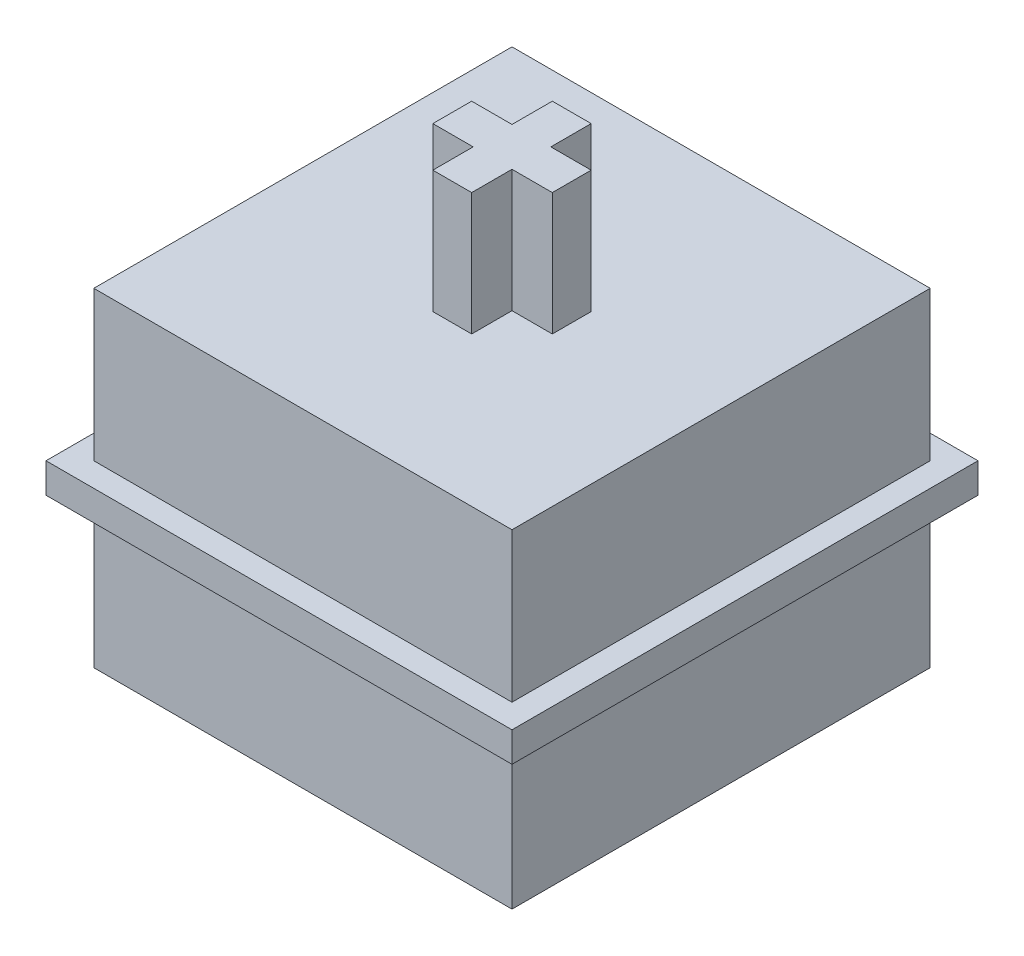
ISO-10303-21;
HEADER;
FILE_DESCRIPTION(('STEP AP214'),'2;1');
FILE_NAME('part.step','',(''),(''),'','','');
FILE_SCHEMA(('AUTOMOTIVE_DESIGN { 1 0 10303 214 1 1 1 1 }'));
ENDSEC;
DATA;
#1=APPLICATION_CONTEXT('core data for automotive mechanical design processes');
#2=APPLICATION_PROTOCOL_DEFINITION('international standard','automotive_design',2000,#1);
#3=PRODUCT_CONTEXT('',#1,'mechanical');
#4=PRODUCT('Part','Part','',(#3));
#5=PRODUCT_RELATED_PRODUCT_CATEGORY('part','',(#4));
#6=PRODUCT_DEFINITION_FORMATION('','',#4);
#7=PRODUCT_DEFINITION_CONTEXT('part definition',#1,'design');
#8=PRODUCT_DEFINITION('design','',#6,#7);
#9=PRODUCT_DEFINITION_SHAPE('','',#8);
#10=(LENGTH_UNIT() NAMED_UNIT(*) SI_UNIT(.MILLI.,.METRE.));
#11=(NAMED_UNIT(*) PLANE_ANGLE_UNIT() SI_UNIT($,.RADIAN.));
#12=(NAMED_UNIT(*) SI_UNIT($,.STERADIAN.) SOLID_ANGLE_UNIT());
#13=UNCERTAINTY_MEASURE_WITH_UNIT(LENGTH_MEASURE(1.E-05),#10,'distance_accuracy_value','');
#14=(GEOMETRIC_REPRESENTATION_CONTEXT(3) GLOBAL_UNCERTAINTY_ASSIGNED_CONTEXT((#13)) GLOBAL_UNIT_ASSIGNED_CONTEXT((#10,
#11,#12)) REPRESENTATION_CONTEXT('',''));
#15=CARTESIAN_POINT('',(0.,0.,0.));
#16=DIRECTION('',(0.,0.,1.));
#17=DIRECTION('',(1.,0.,0.));
#18=AXIS2_PLACEMENT_3D('',#15,#16,#17);
#19=CARTESIAN_POINT('',(0.,11.,0.));
#20=DIRECTION('',(0.,1.,0.));
#21=DIRECTION('',(0.,0.,1.));
#22=AXIS2_PLACEMENT_3D('',#19,#20,#21);
#23=PLANE('',#22);
#24=DIRECTION('',(0.,0.,1.));
#25=VECTOR('',#24,1.);
#26=CARTESIAN_POINT('',(-9.89256198347108,11.,-9.02479338842995));
#27=LINE('',#26,#25);
#28=CARTESIAN_POINT('',(-9.89256198347108,11.,-9.02479338842995));
#29=VERTEX_POINT('',#28);
#30=CARTESIAN_POINT('',(-9.89256198347108,11.,4.97520661157005));
#31=VERTEX_POINT('',#30);
#32=EDGE_CURVE('E240',#29,#31,#27,.T.);
#33=ORIENTED_EDGE('',*,*,#32,.T.);
#34=DIRECTION('',(1.,0.,0.));
#35=VECTOR('',#34,1.);
#36=CARTESIAN_POINT('',(-9.89256198347108,11.,4.97520661157005));
#37=LINE('',#36,#35);
#38=CARTESIAN_POINT('',(4.10743801652892,11.,4.97520661157005));
#39=VERTEX_POINT('',#38);
#40=EDGE_CURVE('E244',#31,#39,#37,.T.);
#41=ORIENTED_EDGE('',*,*,#40,.T.);
#42=DIRECTION('',(0.,0.,-1.));
#43=VECTOR('',#42,1.);
#44=CARTESIAN_POINT('',(4.10743801652892,11.,-9.02479338842995));
#45=LINE('',#44,#43);
#46=CARTESIAN_POINT('',(4.10743801652892,11.,-9.02479338842995));
#47=VERTEX_POINT('',#46);
#48=EDGE_CURVE('E248',#39,#47,#45,.T.);
#49=ORIENTED_EDGE('',*,*,#48,.T.);
#50=DIRECTION('',(-1.,0.,0.));
#51=VECTOR('',#50,1.);
#52=CARTESIAN_POINT('',(-9.89256198347108,11.,-9.02479338842995));
#53=LINE('',#52,#51);
#54=EDGE_CURVE('E251',#47,#29,#53,.T.);
#55=ORIENTED_EDGE('',*,*,#54,.T.);
#56=EDGE_LOOP('',(#33,#41,#49,#55));
#57=FACE_BOUND('',#56,.T.);
#58=DIRECTION('',(0.,0.,1.));
#59=VECTOR('',#58,1.);
#60=CARTESIAN_POINT('',(-4.89256198347108,11.,-1.37479338842995));
#61=LINE('',#60,#59);
#62=CARTESIAN_POINT('',(-4.89256198347108,11.,-2.67479338842995));
#63=VERTEX_POINT('',#62);
#64=CARTESIAN_POINT('',(-4.89256198347108,11.,-1.37479338842995));
#65=VERTEX_POINT('',#64);
#66=EDGE_CURVE('E701',#63,#65,#61,.T.);
#67=ORIENTED_EDGE('',*,*,#66,.F.);
#68=DIRECTION('',(-1.,0.,0.));
#69=VECTOR('',#68,1.);
#70=CARTESIAN_POINT('',(-4.89256198347108,11.,-2.67479338842995));
#71=LINE('',#70,#69);
#72=CARTESIAN_POINT('',(-3.54256198347108,11.,-2.67479338842995));
#73=VERTEX_POINT('',#72);
#74=EDGE_CURVE('E228',#73,#63,#71,.T.);
#75=ORIENTED_EDGE('',*,*,#74,.F.);
#76=DIRECTION('',(0.,0.,1.));
#77=VECTOR('',#76,1.);
#78=CARTESIAN_POINT('',(-3.54256198347108,11.,-2.67479338842995));
#79=LINE('',#78,#77);
#80=CARTESIAN_POINT('',(-3.54256198347108,11.,-4.02479338842995));
#81=VERTEX_POINT('',#80);
#82=EDGE_CURVE('E224',#81,#73,#79,.T.);
#83=ORIENTED_EDGE('',*,*,#82,.F.);
#84=DIRECTION('',(-1.,0.,0.));
#85=VECTOR('',#84,1.);
#86=CARTESIAN_POINT('',(-3.54256198347108,11.,-4.02479338842995));
#87=LINE('',#86,#85);
#88=CARTESIAN_POINT('',(-2.24256198347108,11.,-4.02479338842995));
#89=VERTEX_POINT('',#88);
#90=EDGE_CURVE('E696',#89,#81,#87,.T.);
#91=ORIENTED_EDGE('',*,*,#90,.F.);
#92=DIRECTION('',(0.,0.,-1.));
#93=VECTOR('',#92,1.);
#94=CARTESIAN_POINT('',(-2.24256198347108,11.,-4.02479338842995));
#95=LINE('',#94,#93);
#96=CARTESIAN_POINT('',(-2.24256198347108,11.,-2.67479338842995));
#97=VERTEX_POINT('',#96);
#98=EDGE_CURVE('E730',#97,#89,#95,.T.);
#99=ORIENTED_EDGE('',*,*,#98,.F.);
#100=DIRECTION('',(-1.,0.,0.));
#101=VECTOR('',#100,1.);
#102=CARTESIAN_POINT('',(-2.24256198347108,11.,-2.67479338842995));
#103=LINE('',#102,#101);
#104=CARTESIAN_POINT('',(-0.892561983471083,11.,-2.67479338842995));
#105=VERTEX_POINT('',#104);
#106=EDGE_CURVE('E727',#105,#97,#103,.T.);
#107=ORIENTED_EDGE('',*,*,#106,.F.);
#108=DIRECTION('',(0.,0.,-1.));
#109=VECTOR('',#108,1.);
#110=CARTESIAN_POINT('',(-0.892561983471083,11.,-2.67479338842995));
#111=LINE('',#110,#109);
#112=CARTESIAN_POINT('',(-0.892561983471083,11.,-1.37479338842995));
#113=VERTEX_POINT('',#112);
#114=EDGE_CURVE('E724',#113,#105,#111,.T.);
#115=ORIENTED_EDGE('',*,*,#114,.F.);
#116=DIRECTION('',(1.,0.,0.));
#117=VECTOR('',#116,1.);
#118=CARTESIAN_POINT('',(-0.892561983471083,11.,-1.37479338842995));
#119=LINE('',#118,#117);
#120=CARTESIAN_POINT('',(-2.24256198347108,11.,-1.37479338842995));
#121=VERTEX_POINT('',#120);
#122=EDGE_CURVE('E721',#121,#113,#119,.T.);
#123=ORIENTED_EDGE('',*,*,#122,.F.);
#124=DIRECTION('',(0.,0.,-1.));
#125=VECTOR('',#124,1.);
#126=CARTESIAN_POINT('',(-2.24256198347108,11.,-1.37479338842995));
#127=LINE('',#126,#125);
#128=CARTESIAN_POINT('',(-2.24256198347108,11.,-0.0247933884299467));
#129=VERTEX_POINT('',#128);
#130=EDGE_CURVE('E718',#129,#121,#127,.T.);
#131=ORIENTED_EDGE('',*,*,#130,.F.);
#132=DIRECTION('',(1.,0.,0.));
#133=VECTOR('',#132,1.);
#134=CARTESIAN_POINT('',(-2.24256198347108,11.,-0.0247933884299467));
#135=LINE('',#134,#133);
#136=CARTESIAN_POINT('',(-3.54256198347108,11.,-0.0247933884299467));
#137=VERTEX_POINT('',#136);
#138=EDGE_CURVE('E715',#137,#129,#135,.T.);
#139=ORIENTED_EDGE('',*,*,#138,.F.);
#140=DIRECTION('',(0.,0.,1.));
#141=VECTOR('',#140,1.);
#142=CARTESIAN_POINT('',(-3.54256198347108,11.,-0.0247933884299467));
#143=LINE('',#142,#141);
#144=CARTESIAN_POINT('',(-3.54256198347108,11.,-1.37479338842995));
#145=VERTEX_POINT('',#144);
#146=EDGE_CURVE('E712',#145,#137,#143,.T.);
#147=ORIENTED_EDGE('',*,*,#146,.F.);
#148=DIRECTION('',(1.,0.,0.));
#149=VECTOR('',#148,1.);
#150=CARTESIAN_POINT('',(-3.54256198347108,11.,-1.37479338842995));
#151=LINE('',#150,#149);
#152=EDGE_CURVE('E705',#65,#145,#151,.T.);
#153=ORIENTED_EDGE('',*,*,#152,.F.);
#154=EDGE_LOOP('',(#67,#75,#83,#91,#99,#107,#115,#123,#131,#139,#147,#153));
#155=FACE_BOUND('',#154,.T.);
#156=ADVANCED_FACE('F41',(#57,#155),#23,.T.);
#157=CARTESIAN_POINT('',(4.10743801652892,5.,4.97520661157005));
#158=DIRECTION('',(-1.,0.,0.));
#159=DIRECTION('',(0.,0.,1.));
#160=AXIS2_PLACEMENT_3D('',#157,#158,#159);
#161=PLANE('',#160);
#162=DIRECTION('',(0.,0.,-1.));
#163=VECTOR('',#162,1.);
#164=CARTESIAN_POINT('',(4.10743801652892,0.,4.97520661157005));
#165=LINE('',#164,#163);
#166=CARTESIAN_POINT('',(4.10743801652892,0.,4.97520661157005));
#167=VERTEX_POINT('',#166);
#168=CARTESIAN_POINT('',(4.10743801652892,0.,-9.02479338842995));
#169=VERTEX_POINT('',#168);
#170=EDGE_CURVE('E321',#167,#169,#165,.T.);
#171=ORIENTED_EDGE('',*,*,#170,.T.);
#172=DIRECTION('',(0.,-1.,0.));
#173=VECTOR('',#172,1.);
#174=CARTESIAN_POINT('',(4.10743801652892,5.,-9.02479338842995));
#175=LINE('',#174,#173);
#176=CARTESIAN_POINT('',(4.10743801652892,5.,-9.02479338842995));
#177=VERTEX_POINT('',#176);
#178=EDGE_CURVE('E326',#177,#169,#175,.T.);
#179=ORIENTED_EDGE('',*,*,#178,.F.);
#180=DIRECTION('',(0.,0.,-1.));
#181=VECTOR('',#180,1.);
#182=CARTESIAN_POINT('',(4.10743801652892,5.,4.97520661157005));
#183=LINE('',#182,#181);
#184=CARTESIAN_POINT('',(4.10743801652892,5.,4.97520661157005));
#185=VERTEX_POINT('',#184);
#186=EDGE_CURVE('E327',#185,#177,#183,.T.);
#187=ORIENTED_EDGE('',*,*,#186,.F.);
#188=DIRECTION('',(0.,-1.,0.));
#189=VECTOR('',#188,1.);
#190=CARTESIAN_POINT('',(4.10743801652892,5.,4.97520661157005));
#191=LINE('',#190,#189);
#192=EDGE_CURVE('E344',#185,#167,#191,.T.);
#193=ORIENTED_EDGE('',*,*,#192,.T.);
#194=EDGE_LOOP('',(#171,#179,#187,#193));
#195=FACE_BOUND('',#194,.T.);
#196=ADVANCED_FACE('F389',(#195),#161,.F.);
#197=CARTESIAN_POINT('',(4.10743801652892,5.,-9.02479338842995));
#198=DIRECTION('',(0.,0.,1.));
#199=DIRECTION('',(1.,0.,0.));
#200=AXIS2_PLACEMENT_3D('',#197,#198,#199);
#201=PLANE('',#200);
#202=DIRECTION('',(-1.,0.,0.));
#203=VECTOR('',#202,1.);
#204=CARTESIAN_POINT('',(4.10743801652892,0.,-9.02479338842995));
#205=LINE('',#204,#203);
#206=CARTESIAN_POINT('',(-9.89256198347108,0.,-9.02479338842995));
#207=VERTEX_POINT('',#206);
#208=EDGE_CURVE('E348',#169,#207,#205,.T.);
#209=ORIENTED_EDGE('',*,*,#208,.T.);
#210=DIRECTION('',(0.,-1.,0.));
#211=VECTOR('',#210,1.);
#212=CARTESIAN_POINT('',(-9.89256198347108,5.,-9.02479338842995));
#213=LINE('',#212,#211);
#214=CARTESIAN_POINT('',(-9.89256198347108,5.,-9.02479338842995));
#215=VERTEX_POINT('',#214);
#216=EDGE_CURVE('E363',#215,#207,#213,.T.);
#217=ORIENTED_EDGE('',*,*,#216,.F.);
#218=DIRECTION('',(-1.,0.,0.));
#219=VECTOR('',#218,1.);
#220=CARTESIAN_POINT('',(4.10743801652892,5.,-9.02479338842995));
#221=LINE('',#220,#219);
#222=EDGE_CURVE('E331',#177,#215,#221,.T.);
#223=ORIENTED_EDGE('',*,*,#222,.F.);
#224=ORIENTED_EDGE('',*,*,#178,.T.);
#225=EDGE_LOOP('',(#209,#217,#223,#224));
#226=FACE_BOUND('',#225,.T.);
#227=ADVANCED_FACE('F395',(#226),#201,.F.);
#228=CARTESIAN_POINT('',(-9.89256198347108,5.,4.97520661157005));
#229=DIRECTION('',(1.,0.,0.));
#230=DIRECTION('',(0.,0.,-1.));
#231=AXIS2_PLACEMENT_3D('',#228,#229,#230);
#232=PLANE('',#231);
#233=DIRECTION('',(0.,0.,1.));
#234=VECTOR('',#233,1.);
#235=CARTESIAN_POINT('',(-9.89256198347108,0.,4.97520661157005));
#236=LINE('',#235,#234);
#237=CARTESIAN_POINT('',(-9.89256198347108,0.,4.97520661157005));
#238=VERTEX_POINT('',#237);
#239=EDGE_CURVE('E351',#207,#238,#236,.T.);
#240=ORIENTED_EDGE('',*,*,#239,.T.);
#241=DIRECTION('',(0.,-1.,0.));
#242=VECTOR('',#241,1.);
#243=CARTESIAN_POINT('',(-9.89256198347108,5.,4.97520661157005));
#244=LINE('',#243,#242);
#245=CARTESIAN_POINT('',(-9.89256198347108,5.,4.97520661157005));
#246=VERTEX_POINT('',#245);
#247=EDGE_CURVE('E359',#246,#238,#244,.T.);
#248=ORIENTED_EDGE('',*,*,#247,.F.);
#249=DIRECTION('',(0.,0.,1.));
#250=VECTOR('',#249,1.);
#251=CARTESIAN_POINT('',(-9.89256198347108,5.,4.97520661157005));
#252=LINE('',#251,#250);
#253=EDGE_CURVE('E336',#215,#246,#252,.T.);
#254=ORIENTED_EDGE('',*,*,#253,.F.);
#255=ORIENTED_EDGE('',*,*,#216,.T.);
#256=EDGE_LOOP('',(#240,#248,#254,#255));
#257=FACE_BOUND('',#256,.T.);
#258=ADVANCED_FACE('F445',(#257),#232,.F.);
#259=CARTESIAN_POINT('',(4.10743801652892,5.,4.97520661157005));
#260=DIRECTION('',(0.,0.,-1.));
#261=DIRECTION('',(-1.,0.,0.));
#262=AXIS2_PLACEMENT_3D('',#259,#260,#261);
#263=PLANE('',#262);
#264=DIRECTION('',(1.,0.,0.));
#265=VECTOR('',#264,1.);
#266=CARTESIAN_POINT('',(4.10743801652892,0.,4.97520661157005));
#267=LINE('',#266,#265);
#268=EDGE_CURVE('E332',#238,#167,#267,.T.);
#269=ORIENTED_EDGE('',*,*,#268,.T.);
#270=ORIENTED_EDGE('',*,*,#192,.F.);
#271=DIRECTION('',(1.,0.,0.));
#272=VECTOR('',#271,1.);
#273=CARTESIAN_POINT('',(4.10743801652892,5.,4.97520661157005));
#274=LINE('',#273,#272);
#275=EDGE_CURVE('E340',#246,#185,#274,.T.);
#276=ORIENTED_EDGE('',*,*,#275,.F.);
#277=ORIENTED_EDGE('',*,*,#247,.T.);
#278=EDGE_LOOP('',(#269,#270,#276,#277));
#279=FACE_BOUND('',#278,.T.);
#280=ADVANCED_FACE('F441',(#279),#263,.F.);
#281=CARTESIAN_POINT('',(0.,0.,0.));
#282=DIRECTION('',(0.,1.,0.));
#283=DIRECTION('',(0.,0.,1.));
#284=AXIS2_PLACEMENT_3D('',#281,#282,#283);
#285=PLANE('',#284);
#286=CARTESIAN_POINT('',(-2.89256198347108,0.,-2.02479338842995));
#287=DIRECTION('',(0.,-1.,0.));
#288=DIRECTION('',(0.,0.,-1.));
#289=AXIS2_PLACEMENT_3D('',#286,#287,#288);
#290=CIRCLE('',#289,1.925);
#291=CARTESIAN_POINT('',(-2.89256198347108,0.,-3.94979338842995));
#292=VERTEX_POINT('',#291);
#293=EDGE_CURVE('E322',#292,#292,#290,.T.);
#294=ORIENTED_EDGE('',*,*,#293,.F.);
#295=EDGE_LOOP('',(#294));
#296=FACE_BOUND('',#295,.T.);
#297=ORIENTED_EDGE('',*,*,#170,.F.);
#298=ORIENTED_EDGE('',*,*,#268,.F.);
#299=ORIENTED_EDGE('',*,*,#239,.F.);
#300=ORIENTED_EDGE('',*,*,#208,.F.);
#301=EDGE_LOOP('',(#297,#298,#299,#300));
#302=FACE_BOUND('',#301,.T.);
#303=ADVANCED_FACE('F437',(#296,#302),#285,.F.);
#304=CARTESIAN_POINT('',(-2.89256198347108,-2.8,-2.02479338842995));
#305=DIRECTION('',(0.,1.,0.));
#306=DIRECTION('',(0.,0.,1.));
#307=AXIS2_PLACEMENT_3D('',#304,#305,#306);
#308=CYLINDRICAL_SURFACE('',#307,1.925);
#309=CARTESIAN_POINT('',(-2.89256198347108,-2.3,-2.02479338842995));
#310=DIRECTION('',(0.,-1.,0.));
#311=DIRECTION('',(0.,0.,-1.));
#312=AXIS2_PLACEMENT_3D('',#309,#310,#311);
#313=CIRCLE('',#312,1.925);
#314=CARTESIAN_POINT('',(-2.89256198347108,-2.3,-3.94979338842995));
#315=VERTEX_POINT('',#314);
#316=EDGE_CURVE('E11',#315,#315,#313,.F.);
#317=ORIENTED_EDGE('',*,*,#316,.T.);
#318=EDGE_LOOP('',(#317));
#319=FACE_BOUND('',#318,.T.);
#320=ORIENTED_EDGE('',*,*,#293,.T.);
#321=EDGE_LOOP('',(#320));
#322=FACE_BOUND('',#321,.T.);
#323=ADVANCED_FACE('F385',(#319,#322),#308,.T.);
#324=CARTESIAN_POINT('',(-2.89256198347108,-2.8,-2.02479338842995));
#325=DIRECTION('',(0.,-1.,0.));
#326=DIRECTION('',(0.,0.,-1.));
#327=AXIS2_PLACEMENT_3D('',#324,#325,#326);
#328=PLANE('',#327);
#329=CARTESIAN_POINT('',(-2.89256198347108,-2.8,-2.02479338842995));
#330=DIRECTION('',(0.,-1.,0.));
#331=DIRECTION('',(0.,0.,-1.));
#332=AXIS2_PLACEMENT_3D('',#329,#330,#331);
#333=CIRCLE('',#332,1.425);
#334=CARTESIAN_POINT('',(-2.89256198347108,-2.8,-3.44979338842995));
#335=VERTEX_POINT('',#334);
#336=EDGE_CURVE('E50',#335,#335,#333,.T.);
#337=ORIENTED_EDGE('',*,*,#336,.T.);
#338=EDGE_LOOP('',(#337));
#339=FACE_BOUND('',#338,.T.);
#340=ADVANCED_FACE('F373',(#339),#328,.T.);
#341=CARTESIAN_POINT('',(-2.89256198347108,-2.8,-2.02479338842995));
#342=DIRECTION('',(0.,1.,0.));
#343=DIRECTION('',(0.,0.,1.));
#344=AXIS2_PLACEMENT_3D('',#341,#342,#343);
#345=CONICAL_SURFACE('',#344,1.425,0.785398163397447);
#346=ORIENTED_EDGE('',*,*,#316,.F.);
#347=EDGE_LOOP('',(#346));
#348=FACE_BOUND('',#347,.T.);
#349=ORIENTED_EDGE('',*,*,#336,.F.);
#350=EDGE_LOOP('',(#349));
#351=FACE_BOUND('',#350,.T.);
#352=ADVANCED_FACE('F43',(#348,#351),#345,.T.);
#353=CARTESIAN_POINT('',(0.,5.,0.));
#354=DIRECTION('',(0.,1.,0.));
#355=DIRECTION('',(0.,0.,1.));
#356=AXIS2_PLACEMENT_3D('',#353,#354,#355);
#357=PLANE('',#356);
#358=DIRECTION('',(0.,0.,1.));
#359=VECTOR('',#358,1.);
#360=CARTESIAN_POINT('',(-10.6925619834711,5.,-9.82479338842995));
#361=LINE('',#360,#359);
#362=CARTESIAN_POINT('',(-10.6925619834711,5.,-9.82479338842995));
#363=VERTEX_POINT('',#362);
#364=CARTESIAN_POINT('',(-10.6925619834711,5.,5.77520661157005));
#365=VERTEX_POINT('',#364);
#366=EDGE_CURVE('E279',#363,#365,#361,.T.);
#367=ORIENTED_EDGE('',*,*,#366,.F.);
#368=DIRECTION('',(-1.,0.,0.));
#369=VECTOR('',#368,1.);
#370=CARTESIAN_POINT('',(-10.6925619834711,5.,-9.82479338842995));
#371=LINE('',#370,#369);
#372=CARTESIAN_POINT('',(4.90743801652892,5.,-9.82479338842995));
#373=VERTEX_POINT('',#372);
#374=EDGE_CURVE('E285',#373,#363,#371,.T.);
#375=ORIENTED_EDGE('',*,*,#374,.F.);
#376=DIRECTION('',(0.,0.,-1.));
#377=VECTOR('',#376,1.);
#378=CARTESIAN_POINT('',(4.90743801652892,5.,-9.82479338842995));
#379=LINE('',#378,#377);
#380=CARTESIAN_POINT('',(4.90743801652892,5.,5.77520661157005));
#381=VERTEX_POINT('',#380);
#382=EDGE_CURVE('E301',#381,#373,#379,.T.);
#383=ORIENTED_EDGE('',*,*,#382,.F.);
#384=DIRECTION('',(1.,0.,0.));
#385=VECTOR('',#384,1.);
#386=CARTESIAN_POINT('',(-10.6925619834711,5.,5.77520661157005));
#387=LINE('',#386,#385);
#388=EDGE_CURVE('E298',#365,#381,#387,.T.);
#389=ORIENTED_EDGE('',*,*,#388,.F.);
#390=EDGE_LOOP('',(#367,#375,#383,#389));
#391=FACE_BOUND('',#390,.T.);
#392=ORIENTED_EDGE('',*,*,#275,.T.);
#393=ORIENTED_EDGE('',*,*,#186,.T.);
#394=ORIENTED_EDGE('',*,*,#222,.T.);
#395=ORIENTED_EDGE('',*,*,#253,.T.);
#396=EDGE_LOOP('',(#392,#393,#394,#395));
#397=FACE_BOUND('',#396,.T.);
#398=ADVANCED_FACE('F376',(#391,#397),#357,.F.);
#399=CARTESIAN_POINT('',(-10.6925619834711,6.,-9.82479338842995));
#400=DIRECTION('',(1.,0.,0.));
#401=DIRECTION('',(0.,0.,-1.));
#402=AXIS2_PLACEMENT_3D('',#399,#400,#401);
#403=PLANE('',#402);
#404=ORIENTED_EDGE('',*,*,#366,.T.);
#405=DIRECTION('',(0.,-1.,0.));
#406=VECTOR('',#405,1.);
#407=CARTESIAN_POINT('',(-10.6925619834711,6.,5.77520661157005));
#408=LINE('',#407,#406);
#409=CARTESIAN_POINT('',(-10.6925619834711,6.,5.77520661157005));
#410=VERTEX_POINT('',#409);
#411=EDGE_CURVE('E317',#410,#365,#408,.T.);
#412=ORIENTED_EDGE('',*,*,#411,.F.);
#413=DIRECTION('',(0.,0.,1.));
#414=VECTOR('',#413,1.);
#415=CARTESIAN_POINT('',(-10.6925619834711,6.,-9.82479338842995));
#416=LINE('',#415,#414);
#417=CARTESIAN_POINT('',(-10.6925619834711,6.,-9.82479338842995));
#418=VERTEX_POINT('',#417);
#419=EDGE_CURVE('E280',#418,#410,#416,.T.);
#420=ORIENTED_EDGE('',*,*,#419,.F.);
#421=DIRECTION('',(0.,-1.,0.));
#422=VECTOR('',#421,1.);
#423=CARTESIAN_POINT('',(-10.6925619834711,6.,-9.82479338842995));
#424=LINE('',#423,#422);
#425=EDGE_CURVE('E294',#418,#363,#424,.T.);
#426=ORIENTED_EDGE('',*,*,#425,.T.);
#427=EDGE_LOOP('',(#404,#412,#420,#426));
#428=FACE_BOUND('',#427,.T.);
#429=ADVANCED_FACE('F382',(#428),#403,.F.);
#430=CARTESIAN_POINT('',(-10.6925619834711,6.,5.77520661157005));
#431=DIRECTION('',(0.,0.,-1.));
#432=DIRECTION('',(-1.,0.,0.));
#433=AXIS2_PLACEMENT_3D('',#430,#431,#432);
#434=PLANE('',#433);
#435=ORIENTED_EDGE('',*,*,#388,.T.);
#436=DIRECTION('',(0.,-1.,0.));
#437=VECTOR('',#436,1.);
#438=CARTESIAN_POINT('',(4.90743801652892,6.,5.77520661157005));
#439=LINE('',#438,#437);
#440=CARTESIAN_POINT('',(4.90743801652892,6.,5.77520661157005));
#441=VERTEX_POINT('',#440);
#442=EDGE_CURVE('E313',#441,#381,#439,.T.);
#443=ORIENTED_EDGE('',*,*,#442,.F.);
#444=DIRECTION('',(1.,0.,0.));
#445=VECTOR('',#444,1.);
#446=CARTESIAN_POINT('',(-10.6925619834711,6.,5.77520661157005));
#447=LINE('',#446,#445);
#448=EDGE_CURVE('E284',#410,#441,#447,.T.);
#449=ORIENTED_EDGE('',*,*,#448,.F.);
#450=ORIENTED_EDGE('',*,*,#411,.T.);
#451=EDGE_LOOP('',(#435,#443,#449,#450));
#452=FACE_BOUND('',#451,.T.);
#453=ADVANCED_FACE('F427',(#452),#434,.F.);
#454=CARTESIAN_POINT('',(4.90743801652892,6.,-9.82479338842995));
#455=DIRECTION('',(-1.,0.,0.));
#456=DIRECTION('',(0.,0.,1.));
#457=AXIS2_PLACEMENT_3D('',#454,#455,#456);
#458=PLANE('',#457);
#459=ORIENTED_EDGE('',*,*,#382,.T.);
#460=DIRECTION('',(0.,-1.,0.));
#461=VECTOR('',#460,1.);
#462=CARTESIAN_POINT('',(4.90743801652892,6.,-9.82479338842995));
#463=LINE('',#462,#461);
#464=CARTESIAN_POINT('',(4.90743801652892,6.,-9.82479338842995));
#465=VERTEX_POINT('',#464);
#466=EDGE_CURVE('E309',#465,#373,#463,.T.);
#467=ORIENTED_EDGE('',*,*,#466,.F.);
#468=DIRECTION('',(0.,0.,-1.));
#469=VECTOR('',#468,1.);
#470=CARTESIAN_POINT('',(4.90743801652892,6.,-9.82479338842995));
#471=LINE('',#470,#469);
#472=EDGE_CURVE('E288',#441,#465,#471,.T.);
#473=ORIENTED_EDGE('',*,*,#472,.F.);
#474=ORIENTED_EDGE('',*,*,#442,.T.);
#475=EDGE_LOOP('',(#459,#467,#473,#474));
#476=FACE_BOUND('',#475,.T.);
#477=ADVANCED_FACE('F423',(#476),#458,.F.);
#478=CARTESIAN_POINT('',(-10.6925619834711,6.,-9.82479338842995));
#479=DIRECTION('',(0.,0.,1.));
#480=DIRECTION('',(1.,0.,0.));
#481=AXIS2_PLACEMENT_3D('',#478,#479,#480);
#482=PLANE('',#481);
#483=ORIENTED_EDGE('',*,*,#374,.T.);
#484=ORIENTED_EDGE('',*,*,#425,.F.);
#485=DIRECTION('',(-1.,0.,0.));
#486=VECTOR('',#485,1.);
#487=CARTESIAN_POINT('',(-10.6925619834711,6.,-9.82479338842995));
#488=LINE('',#487,#486);
#489=EDGE_CURVE('E291',#465,#418,#488,.T.);
#490=ORIENTED_EDGE('',*,*,#489,.F.);
#491=ORIENTED_EDGE('',*,*,#466,.T.);
#492=EDGE_LOOP('',(#483,#484,#490,#491));
#493=FACE_BOUND('',#492,.T.);
#494=ADVANCED_FACE('F419',(#493),#482,.F.);
#495=CARTESIAN_POINT('',(0.,6.,0.));
#496=DIRECTION('',(0.,1.,0.));
#497=DIRECTION('',(0.,0.,1.));
#498=AXIS2_PLACEMENT_3D('',#495,#496,#497);
#499=PLANE('',#498);
#500=DIRECTION('',(0.,0.,1.));
#501=VECTOR('',#500,1.);
#502=CARTESIAN_POINT('',(-9.89256198347108,6.,-9.02479338842995));
#503=LINE('',#502,#501);
#504=CARTESIAN_POINT('',(-9.89256198347108,6.,-9.02479338842995));
#505=VERTEX_POINT('',#504);
#506=CARTESIAN_POINT('',(-9.89256198347108,6.,4.97520661157005));
#507=VERTEX_POINT('',#506);
#508=EDGE_CURVE('E65',#505,#507,#503,.T.);
#509=ORIENTED_EDGE('',*,*,#508,.F.);
#510=DIRECTION('',(-1.,0.,0.));
#511=VECTOR('',#510,1.);
#512=CARTESIAN_POINT('',(-9.89256198347108,6.,-9.02479338842995));
#513=LINE('',#512,#511);
#514=CARTESIAN_POINT('',(4.10743801652892,6.,-9.02479338842995));
#515=VERTEX_POINT('',#514);
#516=EDGE_CURVE('E245',#515,#505,#513,.T.);
#517=ORIENTED_EDGE('',*,*,#516,.F.);
#518=DIRECTION('',(0.,0.,-1.));
#519=VECTOR('',#518,1.);
#520=CARTESIAN_POINT('',(4.10743801652892,6.,-9.02479338842995));
#521=LINE('',#520,#519);
#522=CARTESIAN_POINT('',(4.10743801652892,6.,4.97520661157005));
#523=VERTEX_POINT('',#522);
#524=EDGE_CURVE('E258',#523,#515,#521,.T.);
#525=ORIENTED_EDGE('',*,*,#524,.F.);
#526=DIRECTION('',(1.,0.,0.));
#527=VECTOR('',#526,1.);
#528=CARTESIAN_POINT('',(-9.89256198347108,6.,4.97520661157005));
#529=LINE('',#528,#527);
#530=EDGE_CURVE('E234',#507,#523,#529,.T.);
#531=ORIENTED_EDGE('',*,*,#530,.F.);
#532=EDGE_LOOP('',(#509,#517,#525,#531));
#533=FACE_BOUND('',#532,.T.);
#534=ORIENTED_EDGE('',*,*,#419,.T.);
#535=ORIENTED_EDGE('',*,*,#448,.T.);
#536=ORIENTED_EDGE('',*,*,#472,.T.);
#537=ORIENTED_EDGE('',*,*,#489,.T.);
#538=EDGE_LOOP('',(#534,#535,#536,#537));
#539=FACE_BOUND('',#538,.T.);
#540=ADVANCED_FACE('F416',(#533,#539),#499,.T.);
#541=CARTESIAN_POINT('',(-9.89256198347108,11.,-9.02479338842995));
#542=DIRECTION('',(1.,0.,0.));
#543=DIRECTION('',(0.,0.,-1.));
#544=AXIS2_PLACEMENT_3D('',#541,#542,#543);
#545=PLANE('',#544);
#546=ORIENTED_EDGE('',*,*,#508,.T.);
#547=DIRECTION('',(0.,-1.,0.));
#548=VECTOR('',#547,1.);
#549=CARTESIAN_POINT('',(-9.89256198347108,11.,4.97520661157005));
#550=LINE('',#549,#548);
#551=EDGE_CURVE('E275',#31,#507,#550,.T.);
#552=ORIENTED_EDGE('',*,*,#551,.F.);
#553=ORIENTED_EDGE('',*,*,#32,.F.);
#554=DIRECTION('',(0.,-1.,0.));
#555=VECTOR('',#554,1.);
#556=CARTESIAN_POINT('',(-9.89256198347108,11.,-9.02479338842995));
#557=LINE('',#556,#555);
#558=EDGE_CURVE('E253',#29,#505,#557,.T.);
#559=ORIENTED_EDGE('',*,*,#558,.T.);
#560=EDGE_LOOP('',(#546,#552,#553,#559));
#561=FACE_BOUND('',#560,.T.);
#562=ADVANCED_FACE('F412',(#561),#545,.F.);
#563=CARTESIAN_POINT('',(-9.89256198347108,11.,4.97520661157005));
#564=DIRECTION('',(0.,0.,-1.));
#565=DIRECTION('',(-1.,0.,0.));
#566=AXIS2_PLACEMENT_3D('',#563,#564,#565);
#567=PLANE('',#566);
#568=ORIENTED_EDGE('',*,*,#530,.T.);
#569=DIRECTION('',(0.,-1.,0.));
#570=VECTOR('',#569,1.);
#571=CARTESIAN_POINT('',(4.10743801652892,11.,4.97520661157005));
#572=LINE('',#571,#570);
#573=EDGE_CURVE('E271',#39,#523,#572,.T.);
#574=ORIENTED_EDGE('',*,*,#573,.F.);
#575=ORIENTED_EDGE('',*,*,#40,.F.);
#576=ORIENTED_EDGE('',*,*,#551,.T.);
#577=EDGE_LOOP('',(#568,#574,#575,#576));
#578=FACE_BOUND('',#577,.T.);
#579=ADVANCED_FACE('F408',(#578),#567,.F.);
#580=CARTESIAN_POINT('',(4.10743801652892,11.,-9.02479338842995));
#581=DIRECTION('',(-1.,0.,0.));
#582=DIRECTION('',(0.,0.,1.));
#583=AXIS2_PLACEMENT_3D('',#580,#581,#582);
#584=PLANE('',#583);
#585=ORIENTED_EDGE('',*,*,#524,.T.);
#586=DIRECTION('',(0.,-1.,0.));
#587=VECTOR('',#586,1.);
#588=CARTESIAN_POINT('',(4.10743801652892,11.,-9.02479338842995));
#589=LINE('',#588,#587);
#590=EDGE_CURVE('E267',#47,#515,#589,.T.);
#591=ORIENTED_EDGE('',*,*,#590,.F.);
#592=ORIENTED_EDGE('',*,*,#48,.F.);
#593=ORIENTED_EDGE('',*,*,#573,.T.);
#594=EDGE_LOOP('',(#585,#591,#592,#593));
#595=FACE_BOUND('',#594,.T.);
#596=ADVANCED_FACE('F404',(#595),#584,.F.);
#597=CARTESIAN_POINT('',(-9.89256198347108,11.,-9.02479338842995));
#598=DIRECTION('',(0.,0.,1.));
#599=DIRECTION('',(1.,0.,0.));
#600=AXIS2_PLACEMENT_3D('',#597,#598,#599);
#601=PLANE('',#600);
#602=ORIENTED_EDGE('',*,*,#516,.T.);
#603=ORIENTED_EDGE('',*,*,#558,.F.);
#604=ORIENTED_EDGE('',*,*,#54,.F.);
#605=ORIENTED_EDGE('',*,*,#590,.T.);
#606=EDGE_LOOP('',(#602,#603,#604,#605));
#607=FACE_BOUND('',#606,.T.);
#608=ADVANCED_FACE('F401',(#607),#601,.F.);
#609=CARTESIAN_POINT('',(-4.89256198347108,15.1,-2.67479338842995));
#610=DIRECTION('',(0.,0.,1.));
#611=DIRECTION('',(1.,0.,0.));
#612=AXIS2_PLACEMENT_3D('',#609,#610,#611);
#613=PLANE('',#612);
#614=ORIENTED_EDGE('',*,*,#74,.T.);
#615=DIRECTION('',(0.,-1.,0.));
#616=VECTOR('',#615,1.);
#617=CARTESIAN_POINT('',(-4.89256198347108,15.1,-2.67479338842995));
#618=LINE('',#617,#616);
#619=CARTESIAN_POINT('',(-4.89256198347108,15.1,-2.67479338842995));
#620=VERTEX_POINT('',#619);
#621=EDGE_CURVE('E207',#620,#63,#618,.T.);
#622=ORIENTED_EDGE('',*,*,#621,.F.);
#623=DIRECTION('',(-1.,0.,0.));
#624=VECTOR('',#623,1.);
#625=CARTESIAN_POINT('',(-4.89256198347108,15.1,-2.67479338842995));
#626=LINE('',#625,#624);
#627=CARTESIAN_POINT('',(-3.54256198347108,15.1,-2.67479338842995));
#628=VERTEX_POINT('',#627);
#629=EDGE_CURVE('E215',#628,#620,#626,.T.);
#630=ORIENTED_EDGE('',*,*,#629,.F.);
#631=DIRECTION('',(0.,-1.,0.));
#632=VECTOR('',#631,1.);
#633=CARTESIAN_POINT('',(-3.54256198347108,15.1,-2.67479338842995));
#634=LINE('',#633,#632);
#635=EDGE_CURVE('E693',#628,#73,#634,.T.);
#636=ORIENTED_EDGE('',*,*,#635,.T.);
#637=EDGE_LOOP('',(#614,#622,#630,#636));
#638=FACE_BOUND('',#637,.T.);
#639=ADVANCED_FACE('F226',(#638),#613,.F.);
#640=CARTESIAN_POINT('',(-4.89256198347108,15.1,-1.37479338842995));
#641=DIRECTION('',(1.,0.,0.));
#642=DIRECTION('',(0.,0.,-1.));
#643=AXIS2_PLACEMENT_3D('',#640,#641,#642);
#644=PLANE('',#643);
#645=ORIENTED_EDGE('',*,*,#66,.T.);
#646=DIRECTION('',(0.,-1.,0.));
#647=VECTOR('',#646,1.);
#648=CARTESIAN_POINT('',(-4.89256198347108,15.1,-1.37479338842995));
#649=LINE('',#648,#647);
#650=CARTESIAN_POINT('',(-4.89256198347108,15.1,-1.37479338842995));
#651=VERTEX_POINT('',#650);
#652=EDGE_CURVE('E210',#651,#65,#649,.T.);
#653=ORIENTED_EDGE('',*,*,#652,.F.);
#654=DIRECTION('',(0.,0.,1.));
#655=VECTOR('',#654,1.);
#656=CARTESIAN_POINT('',(-4.89256198347108,15.1,-1.37479338842995));
#657=LINE('',#656,#655);
#658=EDGE_CURVE('E203',#620,#651,#657,.T.);
#659=ORIENTED_EDGE('',*,*,#658,.F.);
#660=ORIENTED_EDGE('',*,*,#621,.T.);
#661=EDGE_LOOP('',(#645,#653,#659,#660));
#662=FACE_BOUND('',#661,.T.);
#663=ADVANCED_FACE('F205',(#662),#644,.F.);
#664=CARTESIAN_POINT('',(-3.54256198347108,15.1,-1.37479338842995));
#665=DIRECTION('',(0.,0.,-1.));
#666=DIRECTION('',(-1.,0.,0.));
#667=AXIS2_PLACEMENT_3D('',#664,#665,#666);
#668=PLANE('',#667);
#669=ORIENTED_EDGE('',*,*,#152,.T.);
#670=DIRECTION('',(0.,-1.,0.));
#671=VECTOR('',#670,1.);
#672=CARTESIAN_POINT('',(-3.54256198347108,15.1,-1.37479338842995));
#673=LINE('',#672,#671);
#674=CARTESIAN_POINT('',(-3.54256198347108,15.1,-1.37479338842995));
#675=VERTEX_POINT('',#674);
#676=EDGE_CURVE('E236',#675,#145,#673,.T.);
#677=ORIENTED_EDGE('',*,*,#676,.F.);
#678=DIRECTION('',(1.,0.,0.));
#679=VECTOR('',#678,1.);
#680=CARTESIAN_POINT('',(-3.54256198347108,15.1,-1.37479338842995));
#681=LINE('',#680,#679);
#682=EDGE_CURVE('E214',#651,#675,#681,.T.);
#683=ORIENTED_EDGE('',*,*,#682,.F.);
#684=ORIENTED_EDGE('',*,*,#652,.T.);
#685=EDGE_LOOP('',(#669,#677,#683,#684));
#686=FACE_BOUND('',#685,.T.);
#687=ADVANCED_FACE('F573',(#686),#668,.F.);
#688=CARTESIAN_POINT('',(-3.54256198347108,15.1,-0.0247933884299467));
#689=DIRECTION('',(1.,0.,0.));
#690=DIRECTION('',(0.,0.,-1.));
#691=AXIS2_PLACEMENT_3D('',#688,#689,#690);
#692=PLANE('',#691);
#693=ORIENTED_EDGE('',*,*,#146,.T.);
#694=DIRECTION('',(0.,-1.,0.));
#695=VECTOR('',#694,1.);
#696=CARTESIAN_POINT('',(-3.54256198347108,15.1,-0.0247933884299467));
#697=LINE('',#696,#695);
#698=CARTESIAN_POINT('',(-3.54256198347108,15.1,-0.0247933884299467));
#699=VERTEX_POINT('',#698);
#700=EDGE_CURVE('E761',#699,#137,#697,.T.);
#701=ORIENTED_EDGE('',*,*,#700,.F.);
#702=DIRECTION('',(0.,0.,1.));
#703=VECTOR('',#702,1.);
#704=CARTESIAN_POINT('',(-3.54256198347108,15.1,-0.0247933884299467));
#705=LINE('',#704,#703);
#706=EDGE_CURVE('E770',#675,#699,#705,.T.);
#707=ORIENTED_EDGE('',*,*,#706,.F.);
#708=ORIENTED_EDGE('',*,*,#676,.T.);
#709=EDGE_LOOP('',(#693,#701,#707,#708));
#710=FACE_BOUND('',#709,.T.);
#711=ADVANCED_FACE('F580',(#710),#692,.F.);
#712=CARTESIAN_POINT('',(-2.24256198347108,15.1,-0.0247933884299467));
#713=DIRECTION('',(0.,0.,-1.));
#714=DIRECTION('',(-1.,0.,0.));
#715=AXIS2_PLACEMENT_3D('',#712,#713,#714);
#716=PLANE('',#715);
#717=ORIENTED_EDGE('',*,*,#138,.T.);
#718=DIRECTION('',(0.,-1.,0.));
#719=VECTOR('',#718,1.);
#720=CARTESIAN_POINT('',(-2.24256198347108,15.1,-0.0247933884299467));
#721=LINE('',#720,#719);
#722=CARTESIAN_POINT('',(-2.24256198347108,15.1,-0.0247933884299467));
#723=VERTEX_POINT('',#722);
#724=EDGE_CURVE('E757',#723,#129,#721,.T.);
#725=ORIENTED_EDGE('',*,*,#724,.F.);
#726=DIRECTION('',(1.,0.,0.));
#727=VECTOR('',#726,1.);
#728=CARTESIAN_POINT('',(-2.24256198347108,15.1,-0.0247933884299467));
#729=LINE('',#728,#727);
#730=EDGE_CURVE('E782',#699,#723,#729,.T.);
#731=ORIENTED_EDGE('',*,*,#730,.F.);
#732=ORIENTED_EDGE('',*,*,#700,.T.);
#733=EDGE_LOOP('',(#717,#725,#731,#732));
#734=FACE_BOUND('',#733,.T.);
#735=ADVANCED_FACE('F589',(#734),#716,.F.);
#736=CARTESIAN_POINT('',(-2.24256198347108,15.1,-1.37479338842995));
#737=DIRECTION('',(-1.,0.,0.));
#738=DIRECTION('',(0.,0.,1.));
#739=AXIS2_PLACEMENT_3D('',#736,#737,#738);
#740=PLANE('',#739);
#741=ORIENTED_EDGE('',*,*,#130,.T.);
#742=DIRECTION('',(0.,-1.,0.));
#743=VECTOR('',#742,1.);
#744=CARTESIAN_POINT('',(-2.24256198347108,15.1,-1.37479338842995));
#745=LINE('',#744,#743);
#746=CARTESIAN_POINT('',(-2.24256198347108,15.1,-1.37479338842995));
#747=VERTEX_POINT('',#746);
#748=EDGE_CURVE('E753',#747,#121,#745,.T.);
#749=ORIENTED_EDGE('',*,*,#748,.F.);
#750=DIRECTION('',(0.,0.,-1.));
#751=VECTOR('',#750,1.);
#752=CARTESIAN_POINT('',(-2.24256198347108,15.1,-1.37479338842995));
#753=LINE('',#752,#751);
#754=EDGE_CURVE('E778',#723,#747,#753,.T.);
#755=ORIENTED_EDGE('',*,*,#754,.F.);
#756=ORIENTED_EDGE('',*,*,#724,.T.);
#757=EDGE_LOOP('',(#741,#749,#755,#756));
#758=FACE_BOUND('',#757,.T.);
#759=ADVANCED_FACE('F598',(#758),#740,.F.);
#760=CARTESIAN_POINT('',(-0.892561983471083,15.1,-1.37479338842995));
#761=DIRECTION('',(0.,0.,-1.));
#762=DIRECTION('',(-1.,0.,0.));
#763=AXIS2_PLACEMENT_3D('',#760,#761,#762);
#764=PLANE('',#763);
#765=ORIENTED_EDGE('',*,*,#122,.T.);
#766=DIRECTION('',(0.,-1.,0.));
#767=VECTOR('',#766,1.);
#768=CARTESIAN_POINT('',(-0.892561983471083,15.1,-1.37479338842995));
#769=LINE('',#768,#767);
#770=CARTESIAN_POINT('',(-0.892561983471083,15.1,-1.37479338842995));
#771=VERTEX_POINT('',#770);
#772=EDGE_CURVE('E749',#771,#113,#769,.T.);
#773=ORIENTED_EDGE('',*,*,#772,.F.);
#774=DIRECTION('',(1.,0.,0.));
#775=VECTOR('',#774,1.);
#776=CARTESIAN_POINT('',(-0.892561983471083,15.1,-1.37479338842995));
#777=LINE('',#776,#775);
#778=EDGE_CURVE('E781',#747,#771,#777,.T.);
#779=ORIENTED_EDGE('',*,*,#778,.F.);
#780=ORIENTED_EDGE('',*,*,#748,.T.);
#781=EDGE_LOOP('',(#765,#773,#779,#780));
#782=FACE_BOUND('',#781,.T.);
#783=ADVANCED_FACE('F607',(#782),#764,.F.);
#784=CARTESIAN_POINT('',(-0.892561983471083,15.1,-2.67479338842995));
#785=DIRECTION('',(-1.,0.,0.));
#786=DIRECTION('',(0.,0.,1.));
#787=AXIS2_PLACEMENT_3D('',#784,#785,#786);
#788=PLANE('',#787);
#789=ORIENTED_EDGE('',*,*,#114,.T.);
#790=DIRECTION('',(0.,-1.,0.));
#791=VECTOR('',#790,1.);
#792=CARTESIAN_POINT('',(-0.892561983471083,15.1,-2.67479338842995));
#793=LINE('',#792,#791);
#794=CARTESIAN_POINT('',(-0.892561983471083,15.1,-2.67479338842995));
#795=VERTEX_POINT('',#794);
#796=EDGE_CURVE('E745',#795,#105,#793,.T.);
#797=ORIENTED_EDGE('',*,*,#796,.F.);
#798=DIRECTION('',(0.,0.,-1.));
#799=VECTOR('',#798,1.);
#800=CARTESIAN_POINT('',(-0.892561983471083,15.1,-2.67479338842995));
#801=LINE('',#800,#799);
#802=EDGE_CURVE('E786',#771,#795,#801,.T.);
#803=ORIENTED_EDGE('',*,*,#802,.F.);
#804=ORIENTED_EDGE('',*,*,#772,.T.);
#805=EDGE_LOOP('',(#789,#797,#803,#804));
#806=FACE_BOUND('',#805,.T.);
#807=ADVANCED_FACE('F616',(#806),#788,.F.);
#808=CARTESIAN_POINT('',(-2.24256198347108,15.1,-2.67479338842995));
#809=DIRECTION('',(0.,0.,1.));
#810=DIRECTION('',(1.,0.,0.));
#811=AXIS2_PLACEMENT_3D('',#808,#809,#810);
#812=PLANE('',#811);
#813=ORIENTED_EDGE('',*,*,#106,.T.);
#814=DIRECTION('',(0.,-1.,0.));
#815=VECTOR('',#814,1.);
#816=CARTESIAN_POINT('',(-2.24256198347108,15.1,-2.67479338842995));
#817=LINE('',#816,#815);
#818=CARTESIAN_POINT('',(-2.24256198347108,15.1,-2.67479338842995));
#819=VERTEX_POINT('',#818);
#820=EDGE_CURVE('E741',#819,#97,#817,.T.);
#821=ORIENTED_EDGE('',*,*,#820,.F.);
#822=DIRECTION('',(-1.,0.,0.));
#823=VECTOR('',#822,1.);
#824=CARTESIAN_POINT('',(-2.24256198347108,15.1,-2.67479338842995));
#825=LINE('',#824,#823);
#826=EDGE_CURVE('E793',#795,#819,#825,.T.);
#827=ORIENTED_EDGE('',*,*,#826,.F.);
#828=ORIENTED_EDGE('',*,*,#796,.T.);
#829=EDGE_LOOP('',(#813,#821,#827,#828));
#830=FACE_BOUND('',#829,.T.);
#831=ADVANCED_FACE('F625',(#830),#812,.F.);
#832=CARTESIAN_POINT('',(-2.24256198347108,15.1,-4.02479338842995));
#833=DIRECTION('',(-1.,0.,0.));
#834=DIRECTION('',(0.,0.,1.));
#835=AXIS2_PLACEMENT_3D('',#832,#833,#834);
#836=PLANE('',#835);
#837=ORIENTED_EDGE('',*,*,#98,.T.);
#838=DIRECTION('',(0.,-1.,0.));
#839=VECTOR('',#838,1.);
#840=CARTESIAN_POINT('',(-2.24256198347108,15.1,-4.02479338842995));
#841=LINE('',#840,#839);
#842=CARTESIAN_POINT('',(-2.24256198347108,15.1,-4.02479338842995));
#843=VERTEX_POINT('',#842);
#844=EDGE_CURVE('E737',#843,#89,#841,.T.);
#845=ORIENTED_EDGE('',*,*,#844,.F.);
#846=DIRECTION('',(0.,0.,-1.));
#847=VECTOR('',#846,1.);
#848=CARTESIAN_POINT('',(-2.24256198347108,15.1,-4.02479338842995));
#849=LINE('',#848,#847);
#850=EDGE_CURVE('E796',#819,#843,#849,.T.);
#851=ORIENTED_EDGE('',*,*,#850,.F.);
#852=ORIENTED_EDGE('',*,*,#820,.T.);
#853=EDGE_LOOP('',(#837,#845,#851,#852));
#854=FACE_BOUND('',#853,.T.);
#855=ADVANCED_FACE('F634',(#854),#836,.F.);
#856=CARTESIAN_POINT('',(-3.54256198347108,15.1,-4.02479338842995));
#857=DIRECTION('',(0.,0.,1.));
#858=DIRECTION('',(1.,0.,0.));
#859=AXIS2_PLACEMENT_3D('',#856,#857,#858);
#860=PLANE('',#859);
#861=ORIENTED_EDGE('',*,*,#90,.T.);
#862=DIRECTION('',(0.,-1.,0.));
#863=VECTOR('',#862,1.);
#864=CARTESIAN_POINT('',(-3.54256198347108,15.1,-4.02479338842995));
#865=LINE('',#864,#863);
#866=CARTESIAN_POINT('',(-3.54256198347108,15.1,-4.02479338842995));
#867=VERTEX_POINT('',#866);
#868=EDGE_CURVE('E57',#867,#81,#865,.T.);
#869=ORIENTED_EDGE('',*,*,#868,.F.);
#870=DIRECTION('',(-1.,0.,0.));
#871=VECTOR('',#870,1.);
#872=CARTESIAN_POINT('',(-3.54256198347108,15.1,-4.02479338842995));
#873=LINE('',#872,#871);
#874=EDGE_CURVE('E798',#843,#867,#873,.T.);
#875=ORIENTED_EDGE('',*,*,#874,.F.);
#876=ORIENTED_EDGE('',*,*,#844,.T.);
#877=EDGE_LOOP('',(#861,#869,#875,#876));
#878=FACE_BOUND('',#877,.T.);
#879=ADVANCED_FACE('F643',(#878),#860,.F.);
#880=CARTESIAN_POINT('',(-3.54256198347108,15.1,-2.67479338842995));
#881=DIRECTION('',(1.,0.,0.));
#882=DIRECTION('',(0.,0.,-1.));
#883=AXIS2_PLACEMENT_3D('',#880,#881,#882);
#884=PLANE('',#883);
#885=ORIENTED_EDGE('',*,*,#82,.T.);
#886=ORIENTED_EDGE('',*,*,#635,.F.);
#887=DIRECTION('',(0.,0.,1.));
#888=VECTOR('',#887,1.);
#889=CARTESIAN_POINT('',(-3.54256198347108,15.1,-2.67479338842995));
#890=LINE('',#889,#888);
#891=EDGE_CURVE('E219',#867,#628,#890,.T.);
#892=ORIENTED_EDGE('',*,*,#891,.F.);
#893=ORIENTED_EDGE('',*,*,#868,.T.);
#894=EDGE_LOOP('',(#885,#886,#892,#893));
#895=FACE_BOUND('',#894,.T.);
#896=ADVANCED_FACE('F652',(#895),#884,.F.);
#897=CARTESIAN_POINT('',(0.,15.1,0.));
#898=DIRECTION('',(0.,1.,0.));
#899=DIRECTION('',(0.,0.,1.));
#900=AXIS2_PLACEMENT_3D('',#897,#898,#899);
#901=PLANE('',#900);
#902=ORIENTED_EDGE('',*,*,#629,.T.);
#903=ORIENTED_EDGE('',*,*,#658,.T.);
#904=ORIENTED_EDGE('',*,*,#682,.T.);
#905=ORIENTED_EDGE('',*,*,#706,.T.);
#906=ORIENTED_EDGE('',*,*,#730,.T.);
#907=ORIENTED_EDGE('',*,*,#754,.T.);
#908=ORIENTED_EDGE('',*,*,#778,.T.);
#909=ORIENTED_EDGE('',*,*,#802,.T.);
#910=ORIENTED_EDGE('',*,*,#826,.T.);
#911=ORIENTED_EDGE('',*,*,#850,.T.);
#912=ORIENTED_EDGE('',*,*,#874,.T.);
#913=ORIENTED_EDGE('',*,*,#891,.T.);
#914=EDGE_LOOP('',(#902,#903,#904,#905,#906,#907,#908,#909,#910,#911,#912,#913));
#915=FACE_BOUND('',#914,.T.);
#916=ADVANCED_FACE('F218',(#915),#901,.T.);
#917=CLOSED_SHELL('',(#156,#196,#227,#258,#280,#303,#323,#340,#352,#398,#429,#453,#477,#494,
#540,#562,#579,#596,#608,#639,#663,#687,#711,#735,#759,#783,#807,#831,#855,#879,#896,#916));
#918=MANIFOLD_SOLID_BREP('B2',#917);
#919=ADVANCED_BREP_SHAPE_REPRESENTATION('',(#18,#918),#14);
#920=SHAPE_DEFINITION_REPRESENTATION(#9,#919);
ENDSEC;
END-ISO-10303-21;
